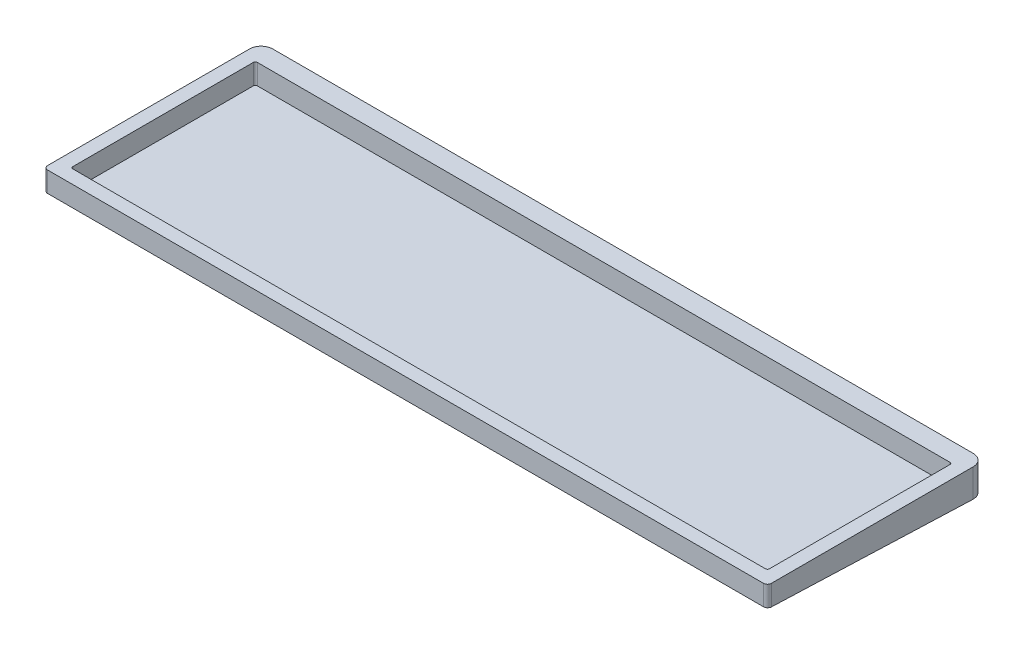
ISO-10303-21;
HEADER;
FILE_DESCRIPTION(('STEP AP214'),'2;1');
FILE_NAME('part.step','',(''),(''),'','','');
FILE_SCHEMA(('AUTOMOTIVE_DESIGN { 1 0 10303 214 1 1 1 1 }'));
ENDSEC;
DATA;
#1=APPLICATION_CONTEXT('core data for automotive mechanical design processes');
#2=APPLICATION_PROTOCOL_DEFINITION('international standard','automotive_design',2000,#1);
#3=PRODUCT_CONTEXT('',#1,'mechanical');
#4=PRODUCT('Part','Part','',(#3));
#5=PRODUCT_RELATED_PRODUCT_CATEGORY('part','',(#4));
#6=PRODUCT_DEFINITION_FORMATION('','',#4);
#7=PRODUCT_DEFINITION_CONTEXT('part definition',#1,'design');
#8=PRODUCT_DEFINITION('design','',#6,#7);
#9=PRODUCT_DEFINITION_SHAPE('','',#8);
#10=(LENGTH_UNIT() NAMED_UNIT(*) SI_UNIT(.MILLI.,.METRE.));
#11=(NAMED_UNIT(*) PLANE_ANGLE_UNIT() SI_UNIT($,.RADIAN.));
#12=(NAMED_UNIT(*) SI_UNIT($,.STERADIAN.) SOLID_ANGLE_UNIT());
#13=UNCERTAINTY_MEASURE_WITH_UNIT(LENGTH_MEASURE(1.E-05),#10,'distance_accuracy_value','');
#14=(GEOMETRIC_REPRESENTATION_CONTEXT(3) GLOBAL_UNCERTAINTY_ASSIGNED_CONTEXT((#13)) GLOBAL_UNIT_ASSIGNED_CONTEXT((#10,
#11,#12)) REPRESENTATION_CONTEXT('',''));
#15=CARTESIAN_POINT('',(0.,0.,0.));
#16=DIRECTION('',(0.,0.,1.));
#17=DIRECTION('',(1.,0.,0.));
#18=AXIS2_PLACEMENT_3D('',#15,#16,#17);
#19=CARTESIAN_POINT('',(-213.175,-25.8484932540624,-15.736065821138));
#20=DIRECTION('',(0.,0.854166260162505,0.52));
#21=DIRECTION('',(0.,-0.52,0.854166260162505));
#22=AXIS2_PLACEMENT_3D('',#19,#20,#21);
#23=PLANE('',#22);
#24=DIRECTION('',(0.,-0.520000000000002,0.854166260162504));
#25=VECTOR('',#24,1.);
#26=CARTESIAN_POINT('',(-146.825,-4.,-51.625));
#27=LINE('',#26,#25);
#28=CARTESIAN_POINT('',(-146.825,-4.,-51.625));
#29=VERTEX_POINT('',#28);
#30=CARTESIAN_POINT('',(-146.825,-10.5,-40.9479217479687));
#31=VERTEX_POINT('',#30);
#32=EDGE_CURVE('E306',#29,#31,#27,.T.);
#33=ORIENTED_EDGE('',*,*,#32,.F.);
#34=DIRECTION('',(1.,0.,0.));
#35=VECTOR('',#34,1.);
#36=CARTESIAN_POINT('',(-213.175,-4.,-51.625));
#37=LINE('',#36,#35);
#38=CARTESIAN_POINT('',(146.825,-4.,-51.625));
#39=VERTEX_POINT('',#38);
#40=EDGE_CURVE('E301',#29,#39,#37,.T.);
#41=ORIENTED_EDGE('',*,*,#40,.T.);
#42=DIRECTION('',(0.,0.520000000000002,-0.854166260162504));
#43=VECTOR('',#42,1.);
#44=CARTESIAN_POINT('',(146.825,-4.,-51.625));
#45=LINE('',#44,#43);
#46=CARTESIAN_POINT('',(146.825,-10.5,-40.9479217479687));
#47=VERTEX_POINT('',#46);
#48=EDGE_CURVE('E383',#47,#39,#45,.T.);
#49=ORIENTED_EDGE('',*,*,#48,.F.);
#50=DIRECTION('',(1.,0.,0.));
#51=VECTOR('',#50,1.);
#52=CARTESIAN_POINT('',(0.,-10.5,-40.9479217479687));
#53=LINE('',#52,#51);
#54=EDGE_CURVE('E43',#31,#47,#53,.T.);
#55=ORIENTED_EDGE('',*,*,#54,.F.);
#56=EDGE_LOOP('',(#33,#41,#49,#55));
#57=FACE_BOUND('',#56,.T.);
#58=ADVANCED_FACE('F35',(#57),#23,.F.);
#59=CARTESIAN_POINT('',(-213.175,-5.9297354123837,0.651462994866035));
#60=DIRECTION('',(0.,0.994019066207558,-0.109206666535767));
#61=DIRECTION('',(0.,0.109206666535767,0.994019066207558));
#62=AXIS2_PLACEMENT_3D('',#59,#60,#61);
#63=PLANE('',#62);
#64=CARTESIAN_POINT('',(-184.825,-0.219727508753766,52.625));
#65=DIRECTION('',(0.,0.994019066207558,-0.109206666535767));
#66=DIRECTION('',(0.,-0.109206666535767,-0.994019066207558));
#67=AXIS2_PLACEMENT_3D('',#64,#65,#66);
#68=ELLIPSE('',#67,2.01203384119233,2.);
#69=CARTESIAN_POINT('',(-186.825,-0.219727508753764,52.625));
#70=VERTEX_POINT('',#69);
#71=CARTESIAN_POINT('',(-184.825,0.,54.625));
#72=VERTEX_POINT('',#71);
#73=EDGE_CURVE('E156',#70,#72,#68,.T.);
#74=ORIENTED_EDGE('',*,*,#73,.F.);
#75=DIRECTION('',(-1.,0.,0.));
#76=VECTOR('',#75,1.);
#77=CARTESIAN_POINT('',(-146.825,-0.219727508753764,52.625));
#78=LINE('',#77,#76);
#79=CARTESIAN_POINT('',(-146.825,-0.219727508753764,52.625));
#80=VERTEX_POINT('',#79);
#81=EDGE_CURVE('E357',#80,#70,#78,.T.);
#82=ORIENTED_EDGE('',*,*,#81,.F.);
#83=DIRECTION('',(0.,0.109206666535767,0.994019066207558));
#84=VECTOR('',#83,1.);
#85=CARTESIAN_POINT('',(-146.825,-10.5,-40.9479217479687));
#86=LINE('',#85,#84);
#87=EDGE_CURVE('E307',#31,#80,#86,.T.);
#88=ORIENTED_EDGE('',*,*,#87,.F.);
#89=ORIENTED_EDGE('',*,*,#54,.T.);
#90=DIRECTION('',(0.,-0.109206666535767,-0.994019066207558));
#91=VECTOR('',#90,1.);
#92=CARTESIAN_POINT('',(146.825,-10.5,-40.9479217479687));
#93=LINE('',#92,#91);
#94=CARTESIAN_POINT('',(146.825,0.,54.625));
#95=VERTEX_POINT('',#94);
#96=EDGE_CURVE('E356',#95,#47,#93,.T.);
#97=ORIENTED_EDGE('',*,*,#96,.F.);
#98=DIRECTION('',(1.,0.,0.));
#99=VECTOR('',#98,1.);
#100=CARTESIAN_POINT('',(-213.175,0.,54.625));
#101=LINE('',#100,#99);
#102=EDGE_CURVE('E324',#72,#95,#101,.T.);
#103=ORIENTED_EDGE('',*,*,#102,.F.);
#104=EDGE_LOOP('',(#74,#82,#88,#89,#97,#103));
#105=FACE_BOUND('',#104,.T.);
#106=ADVANCED_FACE('F388',(#105),#63,.F.);
#107=CARTESIAN_POINT('',(-186.825,10.5,0.));
#108=DIRECTION('',(1.,0.,0.));
#109=DIRECTION('',(0.,0.,-1.));
#110=AXIS2_PLACEMENT_3D('',#107,#108,#109);
#111=PLANE('',#110);
#112=DIRECTION('',(0.,-1.,0.));
#113=VECTOR('',#112,1.);
#114=CARTESIAN_POINT('',(-186.825,10.5,-51.625));
#115=LINE('',#114,#113);
#116=CARTESIAN_POINT('',(-186.825,10.5,-51.625));
#117=VERTEX_POINT('',#116);
#118=CARTESIAN_POINT('',(-186.825,-4.,-51.625));
#119=VERTEX_POINT('',#118);
#120=EDGE_CURVE('E175',#117,#119,#115,.T.);
#121=ORIENTED_EDGE('',*,*,#120,.T.);
#122=DIRECTION('',(0.,-0.0362377898477812,-0.999343195597463));
#123=VECTOR('',#122,1.);
#124=CARTESIAN_POINT('',(-186.825,-0.219727508753764,52.625));
#125=LINE('',#124,#123);
#126=EDGE_CURVE('E298',#70,#119,#125,.T.);
#127=ORIENTED_EDGE('',*,*,#126,.F.);
#128=DIRECTION('',(0.,-1.,0.));
#129=VECTOR('',#128,1.);
#130=CARTESIAN_POINT('',(-186.825,10.5,52.625));
#131=LINE('',#130,#129);
#132=CARTESIAN_POINT('',(-186.825,10.5,52.625));
#133=VERTEX_POINT('',#132);
#134=EDGE_CURVE('E190',#133,#70,#131,.T.);
#135=ORIENTED_EDGE('',*,*,#134,.F.);
#136=DIRECTION('',(0.,0.,1.));
#137=VECTOR('',#136,1.);
#138=CARTESIAN_POINT('',(-186.825,10.5,0.));
#139=LINE('',#138,#137);
#140=EDGE_CURVE('E342',#117,#133,#139,.T.);
#141=ORIENTED_EDGE('',*,*,#140,.F.);
#142=EDGE_LOOP('',(#121,#127,#135,#141));
#143=FACE_BOUND('',#142,.T.);
#144=ADVANCED_FACE('F364',(#143),#111,.F.);
#145=CARTESIAN_POINT('',(-184.825,10.5,52.625));
#146=DIRECTION('',(0.,-1.,0.));
#147=DIRECTION('',(0.,0.,-1.));
#148=AXIS2_PLACEMENT_3D('',#145,#146,#147);
#149=CYLINDRICAL_SURFACE('',#148,2.);
#150=ORIENTED_EDGE('',*,*,#134,.T.);
#151=ORIENTED_EDGE('',*,*,#73,.T.);
#152=DIRECTION('',(0.,-1.,0.));
#153=VECTOR('',#152,1.);
#154=CARTESIAN_POINT('',(-184.825,10.5,54.625));
#155=LINE('',#154,#153);
#156=CARTESIAN_POINT('',(-184.825,10.5,54.625));
#157=VERTEX_POINT('',#156);
#158=EDGE_CURVE('E187',#157,#72,#155,.T.);
#159=ORIENTED_EDGE('',*,*,#158,.F.);
#160=CARTESIAN_POINT('',(-184.825,10.5,52.625));
#161=DIRECTION('',(0.,1.,0.));
#162=DIRECTION('',(0.,0.,1.));
#163=AXIS2_PLACEMENT_3D('',#160,#161,#162);
#164=CIRCLE('',#163,2.);
#165=EDGE_CURVE('E344',#133,#157,#164,.T.);
#166=ORIENTED_EDGE('',*,*,#165,.F.);
#167=EDGE_LOOP('',(#150,#151,#159,#166));
#168=FACE_BOUND('',#167,.T.);
#169=ADVANCED_FACE('F369',(#168),#149,.T.);
#170=CARTESIAN_POINT('',(0.,10.5,54.625));
#171=DIRECTION('',(0.,0.,-1.));
#172=DIRECTION('',(-1.,0.,0.));
#173=AXIS2_PLACEMENT_3D('',#170,#171,#172);
#174=PLANE('',#173);
#175=ORIENTED_EDGE('',*,*,#158,.T.);
#176=ORIENTED_EDGE('',*,*,#102,.T.);
#177=DIRECTION('',(1.,0.,0.));
#178=VECTOR('',#177,1.);
#179=CARTESIAN_POINT('',(146.825,0.,54.625));
#180=LINE('',#179,#178);
#181=CARTESIAN_POINT('',(184.825,0.,54.625));
#182=VERTEX_POINT('',#181);
#183=EDGE_CURVE('E375',#95,#182,#180,.T.);
#184=ORIENTED_EDGE('',*,*,#183,.T.);
#185=DIRECTION('',(0.,-1.,0.));
#186=VECTOR('',#185,1.);
#187=CARTESIAN_POINT('',(184.825,10.5,54.625));
#188=LINE('',#187,#186);
#189=CARTESIAN_POINT('',(184.825,10.5,54.625));
#190=VERTEX_POINT('',#189);
#191=EDGE_CURVE('E184',#190,#182,#188,.T.);
#192=ORIENTED_EDGE('',*,*,#191,.F.);
#193=DIRECTION('',(1.,0.,0.));
#194=VECTOR('',#193,1.);
#195=CARTESIAN_POINT('',(0.,10.5,54.625));
#196=LINE('',#195,#194);
#197=EDGE_CURVE('E346',#157,#190,#196,.T.);
#198=ORIENTED_EDGE('',*,*,#197,.F.);
#199=EDGE_LOOP('',(#175,#176,#184,#192,#198));
#200=FACE_BOUND('',#199,.T.);
#201=ADVANCED_FACE('F372',(#200),#174,.F.);
#202=CARTESIAN_POINT('',(184.825,10.5,52.625));
#203=DIRECTION('',(0.,-1.,0.));
#204=DIRECTION('',(0.,0.,-1.));
#205=AXIS2_PLACEMENT_3D('',#202,#203,#204);
#206=CYLINDRICAL_SURFACE('',#205,2.);
#207=ORIENTED_EDGE('',*,*,#191,.T.);
#208=CARTESIAN_POINT('',(184.825,-0.0752941176470553,52.625));
#209=DIRECTION('',(0.,0.999292101870723,-0.0376204085410155));
#210=DIRECTION('',(0.,-0.0376204085410155,-0.999292101870723));
#211=AXIS2_PLACEMENT_3D('',#208,#209,#210);
#212=ELLIPSE('',#211,2.00141679920807,2.);
#213=CARTESIAN_POINT('',(186.825,-0.0752941176470562,52.625));
#214=VERTEX_POINT('',#213);
#215=EDGE_CURVE('E318',#182,#214,#212,.T.);
#216=ORIENTED_EDGE('',*,*,#215,.T.);
#217=DIRECTION('',(0.,-1.,0.));
#218=VECTOR('',#217,1.);
#219=CARTESIAN_POINT('',(186.825,10.5,52.625));
#220=LINE('',#219,#218);
#221=CARTESIAN_POINT('',(186.825,10.5,52.625));
#222=VERTEX_POINT('',#221);
#223=EDGE_CURVE('E181',#222,#214,#220,.T.);
#224=ORIENTED_EDGE('',*,*,#223,.F.);
#225=CARTESIAN_POINT('',(184.825,10.5,52.625));
#226=DIRECTION('',(0.,1.,0.));
#227=DIRECTION('',(0.,0.,1.));
#228=AXIS2_PLACEMENT_3D('',#225,#226,#227);
#229=CIRCLE('',#228,2.);
#230=EDGE_CURVE('E348',#190,#222,#229,.T.);
#231=ORIENTED_EDGE('',*,*,#230,.F.);
#232=EDGE_LOOP('',(#207,#216,#224,#231));
#233=FACE_BOUND('',#232,.T.);
#234=ADVANCED_FACE('F377',(#233),#206,.T.);
#235=CARTESIAN_POINT('',(186.825,10.5,0.));
#236=DIRECTION('',(1.,0.,0.));
#237=DIRECTION('',(0.,0.,-1.));
#238=AXIS2_PLACEMENT_3D('',#235,#236,#237);
#239=PLANE('',#238);
#240=DIRECTION('',(0.,0.0376204085410155,0.999292101870723));
#241=VECTOR('',#240,1.);
#242=CARTESIAN_POINT('',(186.825,0.,54.625));
#243=LINE('',#242,#241);
#244=CARTESIAN_POINT('',(186.825,-4.,-51.625));
#245=VERTEX_POINT('',#244);
#246=EDGE_CURVE('E353',#245,#214,#243,.T.);
#247=ORIENTED_EDGE('',*,*,#246,.F.);
#248=DIRECTION('',(0.,-1.,0.));
#249=VECTOR('',#248,1.);
#250=CARTESIAN_POINT('',(186.825,10.5,-51.625));
#251=LINE('',#250,#249);
#252=CARTESIAN_POINT('',(186.825,10.5,-51.625));
#253=VERTEX_POINT('',#252);
#254=EDGE_CURVE('E138',#253,#245,#251,.T.);
#255=ORIENTED_EDGE('',*,*,#254,.F.);
#256=DIRECTION('',(0.,0.,1.));
#257=VECTOR('',#256,1.);
#258=CARTESIAN_POINT('',(186.825,10.5,0.));
#259=LINE('',#258,#257);
#260=EDGE_CURVE('E145',#253,#222,#259,.T.);
#261=ORIENTED_EDGE('',*,*,#260,.T.);
#262=ORIENTED_EDGE('',*,*,#223,.T.);
#263=EDGE_LOOP('',(#247,#255,#261,#262));
#264=FACE_BOUND('',#263,.T.);
#265=ADVANCED_FACE('F351',(#264),#239,.T.);
#266=CARTESIAN_POINT('',(180.825,10.5,-51.625));
#267=DIRECTION('',(0.,-1.,0.));
#268=DIRECTION('',(0.,0.,-1.));
#269=AXIS2_PLACEMENT_3D('',#266,#267,#268);
#270=CYLINDRICAL_SURFACE('',#269,6.);
#271=CARTESIAN_POINT('',(180.825,-4.,-51.625));
#272=DIRECTION('',(0.,1.,0.));
#273=DIRECTION('',(0.,0.,1.));
#274=AXIS2_PLACEMENT_3D('',#271,#272,#273);
#275=CIRCLE('',#274,6.);
#276=CARTESIAN_POINT('',(180.825,-4.,-57.625));
#277=VERTEX_POINT('',#276);
#278=EDGE_CURVE('E134',#277,#245,#275,.F.);
#279=ORIENTED_EDGE('',*,*,#278,.F.);
#280=DIRECTION('',(0.,-1.,0.));
#281=VECTOR('',#280,1.);
#282=CARTESIAN_POINT('',(180.825,10.5,-57.625));
#283=LINE('',#282,#281);
#284=CARTESIAN_POINT('',(180.825,10.5,-57.625));
#285=VERTEX_POINT('',#284);
#286=EDGE_CURVE('E127',#285,#277,#283,.T.);
#287=ORIENTED_EDGE('',*,*,#286,.F.);
#288=CARTESIAN_POINT('',(180.825,10.5,-51.625));
#289=DIRECTION('',(0.,1.,0.));
#290=DIRECTION('',(0.,0.,1.));
#291=AXIS2_PLACEMENT_3D('',#288,#289,#290);
#292=CIRCLE('',#291,6.);
#293=EDGE_CURVE('E131',#285,#253,#292,.F.);
#294=ORIENTED_EDGE('',*,*,#293,.T.);
#295=ORIENTED_EDGE('',*,*,#254,.T.);
#296=EDGE_LOOP('',(#279,#287,#294,#295));
#297=FACE_BOUND('',#296,.T.);
#298=ADVANCED_FACE('F129',(#297),#270,.T.);
#299=CARTESIAN_POINT('',(0.,10.5,-57.625));
#300=DIRECTION('',(0.,0.,-1.));
#301=DIRECTION('',(-1.,0.,0.));
#302=AXIS2_PLACEMENT_3D('',#299,#300,#301);
#303=PLANE('',#302);
#304=DIRECTION('',(1.,0.,0.));
#305=VECTOR('',#304,1.);
#306=CARTESIAN_POINT('',(-213.175,-4.,-57.625));
#307=LINE('',#306,#305);
#308=CARTESIAN_POINT('',(-180.825,-4.,-57.625));
#309=VERTEX_POINT('',#308);
#310=EDGE_CURVE('E317',#309,#277,#307,.T.);
#311=ORIENTED_EDGE('',*,*,#310,.F.);
#312=DIRECTION('',(0.,-1.,0.));
#313=VECTOR('',#312,1.);
#314=CARTESIAN_POINT('',(-180.825,10.5,-57.625));
#315=LINE('',#314,#313);
#316=CARTESIAN_POINT('',(-180.825,10.5,-57.625));
#317=VERTEX_POINT('',#316);
#318=EDGE_CURVE('E139',#317,#309,#315,.T.);
#319=ORIENTED_EDGE('',*,*,#318,.F.);
#320=DIRECTION('',(1.,0.,0.));
#321=VECTOR('',#320,1.);
#322=CARTESIAN_POINT('',(0.,10.5,-57.625));
#323=LINE('',#322,#321);
#324=EDGE_CURVE('E143',#317,#285,#323,.T.);
#325=ORIENTED_EDGE('',*,*,#324,.T.);
#326=ORIENTED_EDGE('',*,*,#286,.T.);
#327=EDGE_LOOP('',(#311,#319,#325,#326));
#328=FACE_BOUND('',#327,.T.);
#329=ADVANCED_FACE('F147',(#328),#303,.T.);
#330=CARTESIAN_POINT('',(-178.825,10.5,-46.625));
#331=DIRECTION('',(0.,-1.,0.));
#332=DIRECTION('',(0.,0.,-1.));
#333=AXIS2_PLACEMENT_3D('',#330,#331,#332);
#334=CYLINDRICAL_SURFACE('',#333,1.);
#335=CARTESIAN_POINT('',(-178.825,0.,-46.625));
#336=DIRECTION('',(0.,1.,0.));
#337=DIRECTION('',(0.,0.,1.));
#338=AXIS2_PLACEMENT_3D('',#335,#336,#337);
#339=CIRCLE('',#338,1.);
#340=CARTESIAN_POINT('',(-178.825,0.,-47.625));
#341=VERTEX_POINT('',#340);
#342=CARTESIAN_POINT('',(-179.825,0.,-46.625));
#343=VERTEX_POINT('',#342);
#344=EDGE_CURVE('E82',#341,#343,#339,.T.);
#345=ORIENTED_EDGE('',*,*,#344,.F.);
#346=DIRECTION('',(0.,-1.,0.));
#347=VECTOR('',#346,1.);
#348=CARTESIAN_POINT('',(-178.825,10.5,-47.625));
#349=LINE('',#348,#347);
#350=CARTESIAN_POINT('',(-178.825,10.5,-47.625));
#351=VERTEX_POINT('',#350);
#352=EDGE_CURVE('E178',#351,#341,#349,.T.);
#353=ORIENTED_EDGE('',*,*,#352,.F.);
#354=CARTESIAN_POINT('',(-178.825,10.5,-46.625));
#355=DIRECTION('',(0.,1.,0.));
#356=DIRECTION('',(0.,0.,1.));
#357=AXIS2_PLACEMENT_3D('',#354,#355,#356);
#358=CIRCLE('',#357,1.);
#359=CARTESIAN_POINT('',(-179.825,10.5,-46.625));
#360=VERTEX_POINT('',#359);
#361=EDGE_CURVE('E174',#351,#360,#358,.T.);
#362=ORIENTED_EDGE('',*,*,#361,.T.);
#363=DIRECTION('',(0.,-1.,0.));
#364=VECTOR('',#363,1.);
#365=CARTESIAN_POINT('',(-179.825,10.5,-46.625));
#366=LINE('',#365,#364);
#367=EDGE_CURVE('E150',#360,#343,#366,.T.);
#368=ORIENTED_EDGE('',*,*,#367,.T.);
#369=EDGE_LOOP('',(#345,#353,#362,#368));
#370=FACE_BOUND('',#369,.T.);
#371=ADVANCED_FACE('F37',(#370),#334,.F.);
#372=CARTESIAN_POINT('',(0.,10.5,-47.625));
#373=DIRECTION('',(0.,0.,-1.));
#374=DIRECTION('',(-1.,0.,0.));
#375=AXIS2_PLACEMENT_3D('',#372,#373,#374);
#376=PLANE('',#375);
#377=DIRECTION('',(1.,0.,0.));
#378=VECTOR('',#377,1.);
#379=CARTESIAN_POINT('',(0.,0.,-47.625));
#380=LINE('',#379,#378);
#381=CARTESIAN_POINT('',(178.825,0.,-47.625));
#382=VERTEX_POINT('',#381);
#383=EDGE_CURVE('E155',#341,#382,#380,.T.);
#384=ORIENTED_EDGE('',*,*,#383,.T.);
#385=DIRECTION('',(0.,-1.,0.));
#386=VECTOR('',#385,1.);
#387=CARTESIAN_POINT('',(178.825,10.5,-47.625));
#388=LINE('',#387,#386);
#389=CARTESIAN_POINT('',(178.825,10.5,-47.625));
#390=VERTEX_POINT('',#389);
#391=EDGE_CURVE('E209',#390,#382,#388,.T.);
#392=ORIENTED_EDGE('',*,*,#391,.F.);
#393=DIRECTION('',(1.,0.,0.));
#394=VECTOR('',#393,1.);
#395=CARTESIAN_POINT('',(0.,10.5,-47.625));
#396=LINE('',#395,#394);
#397=EDGE_CURVE('E217',#351,#390,#396,.T.);
#398=ORIENTED_EDGE('',*,*,#397,.F.);
#399=ORIENTED_EDGE('',*,*,#352,.T.);
#400=EDGE_LOOP('',(#384,#392,#398,#399));
#401=FACE_BOUND('',#400,.T.);
#402=ADVANCED_FACE('F215',(#401),#376,.F.);
#403=CARTESIAN_POINT('',(178.825,10.5,-46.625));
#404=DIRECTION('',(0.,-1.,0.));
#405=DIRECTION('',(0.,0.,-1.));
#406=AXIS2_PLACEMENT_3D('',#403,#404,#405);
#407=CYLINDRICAL_SURFACE('',#406,0.999999999999994);
#408=CARTESIAN_POINT('',(178.825,0.,-46.625));
#409=DIRECTION('',(0.,1.,0.));
#410=DIRECTION('',(0.,0.,1.));
#411=AXIS2_PLACEMENT_3D('',#408,#409,#410);
#412=CIRCLE('',#411,0.999999999999994);
#413=CARTESIAN_POINT('',(179.825,0.,-46.625));
#414=VERTEX_POINT('',#413);
#415=EDGE_CURVE('E72',#414,#382,#412,.T.);
#416=ORIENTED_EDGE('',*,*,#415,.F.);
#417=DIRECTION('',(0.,-1.,0.));
#418=VECTOR('',#417,1.);
#419=CARTESIAN_POINT('',(179.825,10.5,-46.625));
#420=LINE('',#419,#418);
#421=CARTESIAN_POINT('',(179.825,10.5,-46.625));
#422=VERTEX_POINT('',#421);
#423=EDGE_CURVE('E206',#422,#414,#420,.T.);
#424=ORIENTED_EDGE('',*,*,#423,.F.);
#425=CARTESIAN_POINT('',(178.825,10.5,-46.625));
#426=DIRECTION('',(0.,1.,0.));
#427=DIRECTION('',(0.,0.,1.));
#428=AXIS2_PLACEMENT_3D('',#425,#426,#427);
#429=CIRCLE('',#428,0.999999999999994);
#430=EDGE_CURVE('E331',#422,#390,#429,.T.);
#431=ORIENTED_EDGE('',*,*,#430,.T.);
#432=ORIENTED_EDGE('',*,*,#391,.T.);
#433=EDGE_LOOP('',(#416,#424,#431,#432));
#434=FACE_BOUND('',#433,.T.);
#435=ADVANCED_FACE('F440',(#434),#407,.F.);
#436=CARTESIAN_POINT('',(179.825,10.5,0.));
#437=DIRECTION('',(1.,0.,0.));
#438=DIRECTION('',(0.,0.,-1.));
#439=AXIS2_PLACEMENT_3D('',#436,#437,#438);
#440=PLANE('',#439);
#441=DIRECTION('',(0.,0.,1.));
#442=VECTOR('',#441,1.);
#443=CARTESIAN_POINT('',(179.825,0.,0.));
#444=LINE('',#443,#442);
#445=CARTESIAN_POINT('',(179.825,0.,46.625));
#446=VERTEX_POINT('',#445);
#447=EDGE_CURVE('E160',#414,#446,#444,.T.);
#448=ORIENTED_EDGE('',*,*,#447,.T.);
#449=DIRECTION('',(0.,-1.,0.));
#450=VECTOR('',#449,1.);
#451=CARTESIAN_POINT('',(179.825,10.5,46.625));
#452=LINE('',#451,#450);
#453=CARTESIAN_POINT('',(179.825,10.5,46.625));
#454=VERTEX_POINT('',#453);
#455=EDGE_CURVE('E203',#454,#446,#452,.T.);
#456=ORIENTED_EDGE('',*,*,#455,.F.);
#457=DIRECTION('',(0.,0.,1.));
#458=VECTOR('',#457,1.);
#459=CARTESIAN_POINT('',(179.825,10.5,0.));
#460=LINE('',#459,#458);
#461=EDGE_CURVE('E334',#422,#454,#460,.T.);
#462=ORIENTED_EDGE('',*,*,#461,.F.);
#463=ORIENTED_EDGE('',*,*,#423,.T.);
#464=EDGE_LOOP('',(#448,#456,#462,#463));
#465=FACE_BOUND('',#464,.T.);
#466=ADVANCED_FACE('F437',(#465),#440,.F.);
#467=CARTESIAN_POINT('',(178.825,10.5,46.625));
#468=DIRECTION('',(0.,-1.,0.));
#469=DIRECTION('',(0.,0.,-1.));
#470=AXIS2_PLACEMENT_3D('',#467,#468,#469);
#471=CYLINDRICAL_SURFACE('',#470,0.999999999999994);
#472=CARTESIAN_POINT('',(178.825,0.,46.625));
#473=DIRECTION('',(0.,1.,0.));
#474=DIRECTION('',(0.,0.,1.));
#475=AXIS2_PLACEMENT_3D('',#472,#473,#474);
#476=CIRCLE('',#475,0.999999999999994);
#477=CARTESIAN_POINT('',(178.825,0.,47.625));
#478=VERTEX_POINT('',#477);
#479=EDGE_CURVE('E163',#478,#446,#476,.T.);
#480=ORIENTED_EDGE('',*,*,#479,.F.);
#481=DIRECTION('',(0.,-1.,0.));
#482=VECTOR('',#481,1.);
#483=CARTESIAN_POINT('',(178.825,10.5,47.625));
#484=LINE('',#483,#482);
#485=CARTESIAN_POINT('',(178.825,10.5,47.625));
#486=VERTEX_POINT('',#485);
#487=EDGE_CURVE('E200',#486,#478,#484,.T.);
#488=ORIENTED_EDGE('',*,*,#487,.F.);
#489=CARTESIAN_POINT('',(178.825,10.5,46.625));
#490=DIRECTION('',(0.,1.,0.));
#491=DIRECTION('',(0.,0.,1.));
#492=AXIS2_PLACEMENT_3D('',#489,#490,#491);
#493=CIRCLE('',#492,0.999999999999994);
#494=EDGE_CURVE('E336',#486,#454,#493,.T.);
#495=ORIENTED_EDGE('',*,*,#494,.T.);
#496=ORIENTED_EDGE('',*,*,#455,.T.);
#497=EDGE_LOOP('',(#480,#488,#495,#496));
#498=FACE_BOUND('',#497,.T.);
#499=ADVANCED_FACE('F249',(#498),#471,.F.);
#500=CARTESIAN_POINT('',(0.,10.5,47.625));
#501=DIRECTION('',(0.,0.,-1.));
#502=DIRECTION('',(-1.,0.,0.));
#503=AXIS2_PLACEMENT_3D('',#500,#501,#502);
#504=PLANE('',#503);
#505=DIRECTION('',(1.,0.,0.));
#506=VECTOR('',#505,1.);
#507=CARTESIAN_POINT('',(0.,0.,47.625));
#508=LINE('',#507,#506);
#509=CARTESIAN_POINT('',(-178.825,0.,47.625));
#510=VERTEX_POINT('',#509);
#511=EDGE_CURVE('E166',#510,#478,#508,.T.);
#512=ORIENTED_EDGE('',*,*,#511,.F.);
#513=DIRECTION('',(0.,-1.,0.));
#514=VECTOR('',#513,1.);
#515=CARTESIAN_POINT('',(-178.825,10.5,47.625));
#516=LINE('',#515,#514);
#517=CARTESIAN_POINT('',(-178.825,10.5,47.625));
#518=VERTEX_POINT('',#517);
#519=EDGE_CURVE('E197',#518,#510,#516,.T.);
#520=ORIENTED_EDGE('',*,*,#519,.F.);
#521=DIRECTION('',(1.,0.,0.));
#522=VECTOR('',#521,1.);
#523=CARTESIAN_POINT('',(0.,10.5,47.625));
#524=LINE('',#523,#522);
#525=EDGE_CURVE('E243',#518,#486,#524,.T.);
#526=ORIENTED_EDGE('',*,*,#525,.T.);
#527=ORIENTED_EDGE('',*,*,#487,.T.);
#528=EDGE_LOOP('',(#512,#520,#526,#527));
#529=FACE_BOUND('',#528,.T.);
#530=ADVANCED_FACE('F241',(#529),#504,.T.);
#531=CARTESIAN_POINT('',(-178.825,10.5,46.625));
#532=DIRECTION('',(0.,-1.,0.));
#533=DIRECTION('',(0.,0.,-1.));
#534=AXIS2_PLACEMENT_3D('',#531,#532,#533);
#535=CYLINDRICAL_SURFACE('',#534,1.);
#536=CARTESIAN_POINT('',(-178.825,0.,46.625));
#537=DIRECTION('',(0.,1.,0.));
#538=DIRECTION('',(0.,0.,1.));
#539=AXIS2_PLACEMENT_3D('',#536,#537,#538);
#540=CIRCLE('',#539,1.);
#541=CARTESIAN_POINT('',(-179.825,0.,46.625));
#542=VERTEX_POINT('',#541);
#543=EDGE_CURVE('E169',#542,#510,#540,.T.);
#544=ORIENTED_EDGE('',*,*,#543,.F.);
#545=DIRECTION('',(0.,-1.,0.));
#546=VECTOR('',#545,1.);
#547=CARTESIAN_POINT('',(-179.825,10.5,46.625));
#548=LINE('',#547,#546);
#549=CARTESIAN_POINT('',(-179.825,10.5,46.625));
#550=VERTEX_POINT('',#549);
#551=EDGE_CURVE('E194',#550,#542,#548,.T.);
#552=ORIENTED_EDGE('',*,*,#551,.F.);
#553=CARTESIAN_POINT('',(-178.825,10.5,46.625));
#554=DIRECTION('',(0.,1.,0.));
#555=DIRECTION('',(0.,0.,1.));
#556=AXIS2_PLACEMENT_3D('',#553,#554,#555);
#557=CIRCLE('',#556,1.);
#558=EDGE_CURVE('E237',#550,#518,#557,.T.);
#559=ORIENTED_EDGE('',*,*,#558,.T.);
#560=ORIENTED_EDGE('',*,*,#519,.T.);
#561=EDGE_LOOP('',(#544,#552,#559,#560));
#562=FACE_BOUND('',#561,.T.);
#563=ADVANCED_FACE('F235',(#562),#535,.F.);
#564=CARTESIAN_POINT('',(-179.825,10.5,0.));
#565=DIRECTION('',(1.,0.,0.));
#566=DIRECTION('',(0.,0.,-1.));
#567=AXIS2_PLACEMENT_3D('',#564,#565,#566);
#568=PLANE('',#567);
#569=DIRECTION('',(0.,0.,1.));
#570=VECTOR('',#569,1.);
#571=CARTESIAN_POINT('',(-179.825,0.,0.));
#572=LINE('',#571,#570);
#573=EDGE_CURVE('E172',#343,#542,#572,.T.);
#574=ORIENTED_EDGE('',*,*,#573,.F.);
#575=ORIENTED_EDGE('',*,*,#367,.F.);
#576=DIRECTION('',(0.,0.,1.));
#577=VECTOR('',#576,1.);
#578=CARTESIAN_POINT('',(-179.825,10.5,0.));
#579=LINE('',#578,#577);
#580=EDGE_CURVE('E340',#360,#550,#579,.T.);
#581=ORIENTED_EDGE('',*,*,#580,.T.);
#582=ORIENTED_EDGE('',*,*,#551,.T.);
#583=EDGE_LOOP('',(#574,#575,#581,#582));
#584=FACE_BOUND('',#583,.T.);
#585=ADVANCED_FACE('F228',(#584),#568,.T.);
#586=CARTESIAN_POINT('',(-180.825,10.5,-51.625));
#587=DIRECTION('',(0.,-1.,0.));
#588=DIRECTION('',(0.,0.,-1.));
#589=AXIS2_PLACEMENT_3D('',#586,#587,#588);
#590=CYLINDRICAL_SURFACE('',#589,6.);
#591=ORIENTED_EDGE('',*,*,#318,.T.);
#592=CARTESIAN_POINT('',(-180.825,-4.,-51.625));
#593=DIRECTION('',(0.,1.,0.));
#594=DIRECTION('',(0.,0.,1.));
#595=AXIS2_PLACEMENT_3D('',#592,#593,#594);
#596=CIRCLE('',#595,6.);
#597=EDGE_CURVE('E11',#309,#119,#596,.T.);
#598=ORIENTED_EDGE('',*,*,#597,.T.);
#599=ORIENTED_EDGE('',*,*,#120,.F.);
#600=CARTESIAN_POINT('',(-180.825,10.5,-51.625));
#601=DIRECTION('',(0.,1.,0.));
#602=DIRECTION('',(0.,0.,1.));
#603=AXIS2_PLACEMENT_3D('',#600,#601,#602);
#604=CIRCLE('',#603,6.);
#605=EDGE_CURVE('E58',#317,#117,#604,.T.);
#606=ORIENTED_EDGE('',*,*,#605,.F.);
#607=EDGE_LOOP('',(#591,#598,#599,#606));
#608=FACE_BOUND('',#607,.T.);
#609=ADVANCED_FACE('F360',(#608),#590,.T.);
#610=CARTESIAN_POINT('',(0.,10.5,0.));
#611=DIRECTION('',(0.,1.,0.));
#612=DIRECTION('',(0.,0.,1.));
#613=AXIS2_PLACEMENT_3D('',#610,#611,#612);
#614=PLANE('',#613);
#615=ORIENTED_EDGE('',*,*,#361,.F.);
#616=ORIENTED_EDGE('',*,*,#397,.T.);
#617=ORIENTED_EDGE('',*,*,#430,.F.);
#618=ORIENTED_EDGE('',*,*,#461,.T.);
#619=ORIENTED_EDGE('',*,*,#494,.F.);
#620=ORIENTED_EDGE('',*,*,#525,.F.);
#621=ORIENTED_EDGE('',*,*,#558,.F.);
#622=ORIENTED_EDGE('',*,*,#580,.F.);
#623=EDGE_LOOP('',(#615,#616,#617,#618,#619,#620,#621,#622));
#624=FACE_BOUND('',#623,.T.);
#625=ORIENTED_EDGE('',*,*,#140,.T.);
#626=ORIENTED_EDGE('',*,*,#165,.T.);
#627=ORIENTED_EDGE('',*,*,#197,.T.);
#628=ORIENTED_EDGE('',*,*,#230,.T.);
#629=ORIENTED_EDGE('',*,*,#260,.F.);
#630=ORIENTED_EDGE('',*,*,#293,.F.);
#631=ORIENTED_EDGE('',*,*,#324,.F.);
#632=ORIENTED_EDGE('',*,*,#605,.T.);
#633=EDGE_LOOP('',(#625,#626,#627,#628,#629,#630,#631,#632));
#634=FACE_BOUND('',#633,.T.);
#635=ADVANCED_FACE('F142',(#624,#634),#614,.T.);
#636=CARTESIAN_POINT('',(0.,0.,0.));
#637=DIRECTION('',(0.,-1.,0.));
#638=DIRECTION('',(0.,0.,-1.));
#639=AXIS2_PLACEMENT_3D('',#636,#637,#638);
#640=PLANE('',#639);
#641=ORIENTED_EDGE('',*,*,#383,.F.);
#642=ORIENTED_EDGE('',*,*,#344,.T.);
#643=ORIENTED_EDGE('',*,*,#573,.T.);
#644=ORIENTED_EDGE('',*,*,#543,.T.);
#645=ORIENTED_EDGE('',*,*,#511,.T.);
#646=ORIENTED_EDGE('',*,*,#479,.T.);
#647=ORIENTED_EDGE('',*,*,#447,.F.);
#648=ORIENTED_EDGE('',*,*,#415,.T.);
#649=EDGE_LOOP('',(#641,#642,#643,#644,#645,#646,#647,#648));
#650=FACE_BOUND('',#649,.T.);
#651=ADVANCED_FACE('F230',(#650),#640,.F.);
#652=CARTESIAN_POINT('',(-213.175,-4.,0.));
#653=DIRECTION('',(0.,1.,0.));
#654=DIRECTION('',(0.,0.,1.));
#655=AXIS2_PLACEMENT_3D('',#652,#653,#654);
#656=PLANE('',#655);
#657=ORIENTED_EDGE('',*,*,#278,.T.);
#658=DIRECTION('',(1.,0.,0.));
#659=VECTOR('',#658,1.);
#660=CARTESIAN_POINT('',(146.825,-4.,-51.625));
#661=LINE('',#660,#659);
#662=EDGE_CURVE('E316',#39,#245,#661,.T.);
#663=ORIENTED_EDGE('',*,*,#662,.F.);
#664=ORIENTED_EDGE('',*,*,#40,.F.);
#665=EDGE_CURVE('E292',#119,#29,#37,.T.);
#666=ORIENTED_EDGE('',*,*,#665,.F.);
#667=ORIENTED_EDGE('',*,*,#597,.F.);
#668=ORIENTED_EDGE('',*,*,#310,.T.);
#669=EDGE_LOOP('',(#657,#663,#664,#666,#667,#668));
#670=FACE_BOUND('',#669,.T.);
#671=ADVANCED_FACE('F315',(#670),#656,.F.);
#672=CARTESIAN_POINT('',(146.825,0.,54.625));
#673=DIRECTION('',(0.,0.999292101870723,-0.0376204085410155));
#674=DIRECTION('',(0.,0.0376204085410155,0.999292101870723));
#675=AXIS2_PLACEMENT_3D('',#672,#673,#674);
#676=PLANE('',#675);
#677=ORIENTED_EDGE('',*,*,#183,.F.);
#678=DIRECTION('',(0.,0.0376204085410155,0.999292101870723));
#679=VECTOR('',#678,1.);
#680=CARTESIAN_POINT('',(146.825,0.,54.625));
#681=LINE('',#680,#679);
#682=EDGE_CURVE('E379',#39,#95,#681,.T.);
#683=ORIENTED_EDGE('',*,*,#682,.F.);
#684=ORIENTED_EDGE('',*,*,#662,.T.);
#685=ORIENTED_EDGE('',*,*,#246,.T.);
#686=ORIENTED_EDGE('',*,*,#215,.F.);
#687=EDGE_LOOP('',(#677,#683,#684,#685,#686));
#688=FACE_BOUND('',#687,.T.);
#689=ADVANCED_FACE('F392',(#688),#676,.F.);
#690=CARTESIAN_POINT('',(146.825,0.,0.));
#691=DIRECTION('',(1.,0.,0.));
#692=DIRECTION('',(0.,0.,-1.));
#693=AXIS2_PLACEMENT_3D('',#690,#691,#692);
#694=PLANE('',#693);
#695=ORIENTED_EDGE('',*,*,#96,.T.);
#696=ORIENTED_EDGE('',*,*,#48,.T.);
#697=ORIENTED_EDGE('',*,*,#682,.T.);
#698=EDGE_LOOP('',(#695,#696,#697));
#699=FACE_BOUND('',#698,.T.);
#700=ADVANCED_FACE('F390',(#699),#694,.T.);
#701=CARTESIAN_POINT('',(-146.825,-0.219727508753764,52.625));
#702=DIRECTION('',(0.,0.999343195597463,-0.0362377898477812));
#703=DIRECTION('',(0.,0.0362377898477812,0.999343195597463));
#704=AXIS2_PLACEMENT_3D('',#701,#702,#703);
#705=PLANE('',#704);
#706=ORIENTED_EDGE('',*,*,#126,.T.);
#707=ORIENTED_EDGE('',*,*,#665,.T.);
#708=DIRECTION('',(0.,-0.0362377898477812,-0.999343195597463));
#709=VECTOR('',#708,1.);
#710=CARTESIAN_POINT('',(-146.825,-0.219727508753764,52.625));
#711=LINE('',#710,#709);
#712=EDGE_CURVE('E295',#80,#29,#711,.T.);
#713=ORIENTED_EDGE('',*,*,#712,.F.);
#714=ORIENTED_EDGE('',*,*,#81,.T.);
#715=EDGE_LOOP('',(#706,#707,#713,#714));
#716=FACE_BOUND('',#715,.T.);
#717=ADVANCED_FACE('F294',(#716),#705,.F.);
#718=CARTESIAN_POINT('',(-146.825,0.,0.));
#719=DIRECTION('',(-1.,0.,0.));
#720=DIRECTION('',(0.,0.,1.));
#721=AXIS2_PLACEMENT_3D('',#718,#719,#720);
#722=PLANE('',#721);
#723=ORIENTED_EDGE('',*,*,#712,.T.);
#724=ORIENTED_EDGE('',*,*,#32,.T.);
#725=ORIENTED_EDGE('',*,*,#87,.T.);
#726=EDGE_LOOP('',(#723,#724,#725));
#727=FACE_BOUND('',#726,.T.);
#728=ADVANCED_FACE('F305',(#727),#722,.T.);
#729=CLOSED_SHELL('',(#58,#106,#144,#169,#201,#234,#265,#298,#329,#371,#402,#435,#466,#499,#530,
#563,#585,#609,#635,#651,#671,#689,#700,#717,#728));
#730=MANIFOLD_SOLID_BREP('B2',#729);
#731=ADVANCED_BREP_SHAPE_REPRESENTATION('',(#18,#730),#14);
#732=SHAPE_DEFINITION_REPRESENTATION(#9,#731);
ENDSEC;
END-ISO-10303-21;
